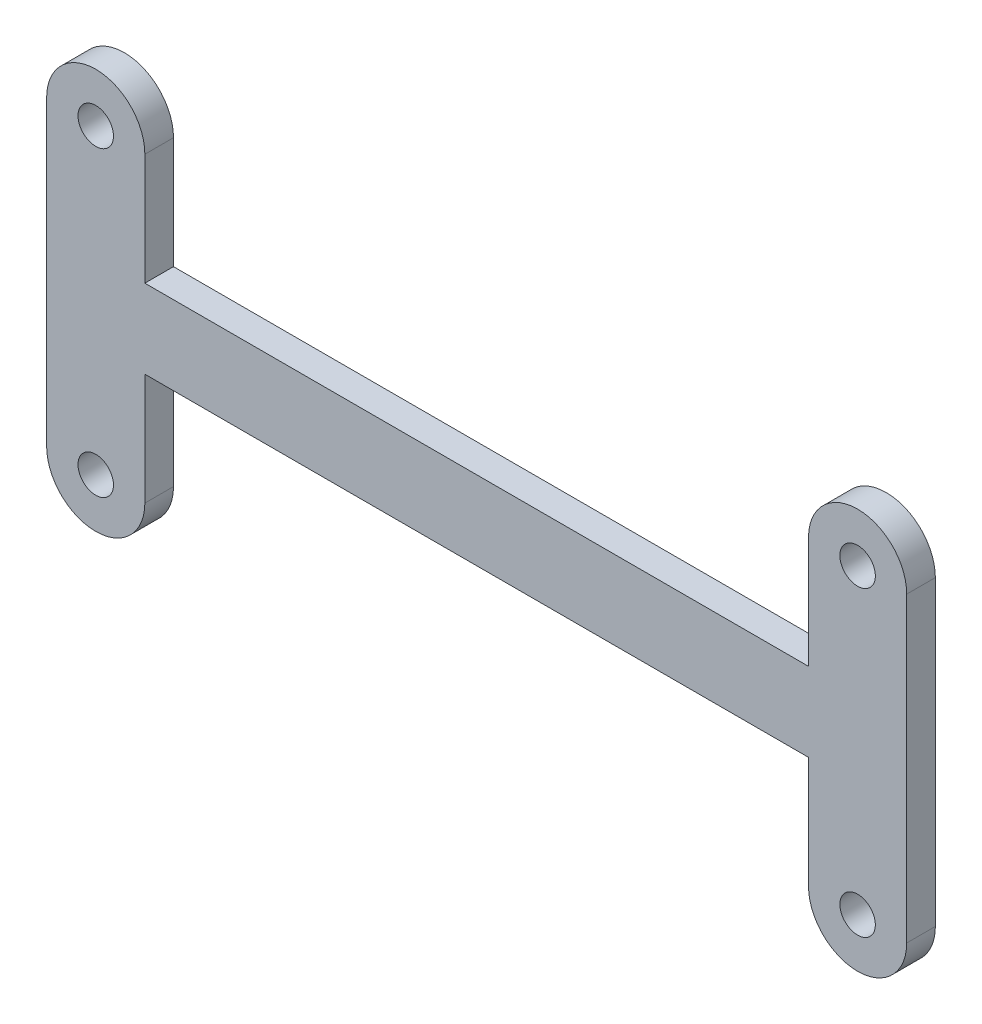
ISO-10303-21;
HEADER;
FILE_DESCRIPTION(('STEP AP214'),'2;1');
FILE_NAME('part.step','',(''),(''),'','','');
FILE_SCHEMA(('AUTOMOTIVE_DESIGN { 1 0 10303 214 1 1 1 1 }'));
ENDSEC;
DATA;
#1=APPLICATION_CONTEXT('core data for automotive mechanical design processes');
#2=APPLICATION_PROTOCOL_DEFINITION('international standard','automotive_design',2000,#1);
#3=PRODUCT_CONTEXT('',#1,'mechanical');
#4=PRODUCT('Part','Part','',(#3));
#5=PRODUCT_RELATED_PRODUCT_CATEGORY('part','',(#4));
#6=PRODUCT_DEFINITION_FORMATION('','',#4);
#7=PRODUCT_DEFINITION_CONTEXT('part definition',#1,'design');
#8=PRODUCT_DEFINITION('design','',#6,#7);
#9=PRODUCT_DEFINITION_SHAPE('','',#8);
#10=(LENGTH_UNIT() NAMED_UNIT(*) SI_UNIT(.MILLI.,.METRE.));
#11=(NAMED_UNIT(*) PLANE_ANGLE_UNIT() SI_UNIT($,.RADIAN.));
#12=(NAMED_UNIT(*) SI_UNIT($,.STERADIAN.) SOLID_ANGLE_UNIT());
#13=UNCERTAINTY_MEASURE_WITH_UNIT(LENGTH_MEASURE(1.E-05),#10,'distance_accuracy_value','');
#14=(GEOMETRIC_REPRESENTATION_CONTEXT(3) GLOBAL_UNCERTAINTY_ASSIGNED_CONTEXT((#13)) GLOBAL_UNIT_ASSIGNED_CONTEXT((#10,
#11,#12)) REPRESENTATION_CONTEXT('',''));
#15=CARTESIAN_POINT('',(0.,0.,0.));
#16=DIRECTION('',(0.,0.,1.));
#17=DIRECTION('',(1.,0.,0.));
#18=AXIS2_PLACEMENT_3D('',#15,#16,#17);
#19=CARTESIAN_POINT('',(-29.,11.5,2.18));
#20=DIRECTION('',(0.,0.,-1.));
#21=DIRECTION('',(-1.,0.,0.));
#22=AXIS2_PLACEMENT_3D('',#19,#20,#21);
#23=CYLINDRICAL_SURFACE('',#22,3.73775917780597);
#24=CARTESIAN_POINT('',(-29.,11.5,0.));
#25=DIRECTION('',(0.,0.,1.));
#26=DIRECTION('',(1.,0.,0.));
#27=AXIS2_PLACEMENT_3D('',#24,#25,#26);
#28=CIRCLE('',#27,3.73775917780597);
#29=CARTESIAN_POINT('',(-25.262240822194,11.5,0.));
#30=VERTEX_POINT('',#29);
#31=CARTESIAN_POINT('',(-32.737759177806,11.5,0.));
#32=VERTEX_POINT('',#31);
#33=EDGE_CURVE('E179',#30,#32,#28,.T.);
#34=ORIENTED_EDGE('',*,*,#33,.T.);
#35=DIRECTION('',(0.,0.,-1.));
#36=VECTOR('',#35,1.);
#37=CARTESIAN_POINT('',(-32.737759177806,11.5,2.18));
#38=LINE('',#37,#36);
#39=CARTESIAN_POINT('',(-32.737759177806,11.5,2.18));
#40=VERTEX_POINT('',#39);
#41=EDGE_CURVE('E11',#40,#32,#38,.T.);
#42=ORIENTED_EDGE('',*,*,#41,.F.);
#43=CARTESIAN_POINT('',(-29.,11.5,2.18));
#44=DIRECTION('',(0.,0.,1.));
#45=DIRECTION('',(1.,0.,0.));
#46=AXIS2_PLACEMENT_3D('',#43,#44,#45);
#47=CIRCLE('',#46,3.73775917780597);
#48=CARTESIAN_POINT('',(-25.262240822194,11.5,2.18));
#49=VERTEX_POINT('',#48);
#50=EDGE_CURVE('E327',#49,#40,#47,.T.);
#51=ORIENTED_EDGE('',*,*,#50,.F.);
#52=DIRECTION('',(0.,0.,-1.));
#53=VECTOR('',#52,1.);
#54=CARTESIAN_POINT('',(-25.262240822194,11.5,2.18));
#55=LINE('',#54,#53);
#56=EDGE_CURVE('E58',#49,#30,#55,.T.);
#57=ORIENTED_EDGE('',*,*,#56,.T.);
#58=EDGE_LOOP('',(#34,#42,#51,#57));
#59=FACE_BOUND('',#58,.T.);
#60=ADVANCED_FACE('F41',(#59),#23,.T.);
#61=CARTESIAN_POINT('',(-32.737759177806,0.,2.18));
#62=DIRECTION('',(1.,0.,0.));
#63=DIRECTION('',(0.,0.,-1.));
#64=AXIS2_PLACEMENT_3D('',#61,#62,#63);
#65=PLANE('',#64);
#66=DIRECTION('',(0.,-1.,0.));
#67=VECTOR('',#66,1.);
#68=CARTESIAN_POINT('',(-32.737759177806,0.,0.));
#69=LINE('',#68,#67);
#70=CARTESIAN_POINT('',(-32.737759177806,-11.5,0.));
#71=VERTEX_POINT('',#70);
#72=EDGE_CURVE('E181',#32,#71,#69,.T.);
#73=ORIENTED_EDGE('',*,*,#72,.T.);
#74=DIRECTION('',(0.,0.,-1.));
#75=VECTOR('',#74,1.);
#76=CARTESIAN_POINT('',(-32.737759177806,-11.5,2.18));
#77=LINE('',#76,#75);
#78=CARTESIAN_POINT('',(-32.737759177806,-11.5,2.18));
#79=VERTEX_POINT('',#78);
#80=EDGE_CURVE('E50',#79,#71,#77,.T.);
#81=ORIENTED_EDGE('',*,*,#80,.F.);
#82=DIRECTION('',(0.,-1.,0.));
#83=VECTOR('',#82,1.);
#84=CARTESIAN_POINT('',(-32.737759177806,0.,2.18));
#85=LINE('',#84,#83);
#86=EDGE_CURVE('E108',#40,#79,#85,.T.);
#87=ORIENTED_EDGE('',*,*,#86,.F.);
#88=ORIENTED_EDGE('',*,*,#41,.T.);
#89=EDGE_LOOP('',(#73,#81,#87,#88));
#90=FACE_BOUND('',#89,.T.);
#91=ADVANCED_FACE('F280',(#90),#65,.F.);
#92=CARTESIAN_POINT('',(-29.,-11.5,2.18));
#93=DIRECTION('',(0.,0.,-1.));
#94=DIRECTION('',(-1.,0.,0.));
#95=AXIS2_PLACEMENT_3D('',#92,#93,#94);
#96=CYLINDRICAL_SURFACE('',#95,3.73775917780597);
#97=CARTESIAN_POINT('',(-29.,-11.5,0.));
#98=DIRECTION('',(0.,0.,1.));
#99=DIRECTION('',(1.,0.,0.));
#100=AXIS2_PLACEMENT_3D('',#97,#98,#99);
#101=CIRCLE('',#100,3.73775917780597);
#102=CARTESIAN_POINT('',(-25.262240822194,-11.5,0.));
#103=VERTEX_POINT('',#102);
#104=EDGE_CURVE('E183',#71,#103,#101,.T.);
#105=ORIENTED_EDGE('',*,*,#104,.T.);
#106=DIRECTION('',(0.,0.,-1.));
#107=VECTOR('',#106,1.);
#108=CARTESIAN_POINT('',(-25.262240822194,-11.5,2.18));
#109=LINE('',#108,#107);
#110=CARTESIAN_POINT('',(-25.262240822194,-11.5,2.18));
#111=VERTEX_POINT('',#110);
#112=EDGE_CURVE('E230',#111,#103,#109,.T.);
#113=ORIENTED_EDGE('',*,*,#112,.F.);
#114=CARTESIAN_POINT('',(-29.,-11.5,2.18));
#115=DIRECTION('',(0.,0.,1.));
#116=DIRECTION('',(1.,0.,0.));
#117=AXIS2_PLACEMENT_3D('',#114,#115,#116);
#118=CIRCLE('',#117,3.73775917780597);
#119=EDGE_CURVE('E237',#79,#111,#118,.T.);
#120=ORIENTED_EDGE('',*,*,#119,.F.);
#121=ORIENTED_EDGE('',*,*,#80,.T.);
#122=EDGE_LOOP('',(#105,#113,#120,#121));
#123=FACE_BOUND('',#122,.T.);
#124=ADVANCED_FACE('F235',(#123),#96,.T.);
#125=CARTESIAN_POINT('',(-25.262240822194,0.,2.18));
#126=DIRECTION('',(1.,0.,0.));
#127=DIRECTION('',(0.,1.,0.));
#128=AXIS2_PLACEMENT_3D('',#125,#126,#127);
#129=PLANE('',#128);
#130=DIRECTION('',(0.,-1.,0.));
#131=VECTOR('',#130,1.);
#132=CARTESIAN_POINT('',(-25.262240822194,0.,0.));
#133=LINE('',#132,#131);
#134=CARTESIAN_POINT('',(-25.262240822194,-3.,0.));
#135=VERTEX_POINT('',#134);
#136=EDGE_CURVE('E186',#135,#103,#133,.T.);
#137=ORIENTED_EDGE('',*,*,#136,.F.);
#138=DIRECTION('',(0.,0.,-1.));
#139=VECTOR('',#138,1.);
#140=CARTESIAN_POINT('',(-25.262240822194,-3.,2.18));
#141=LINE('',#140,#139);
#142=CARTESIAN_POINT('',(-25.262240822194,-3.,2.18));
#143=VERTEX_POINT('',#142);
#144=EDGE_CURVE('E228',#143,#135,#141,.T.);
#145=ORIENTED_EDGE('',*,*,#144,.F.);
#146=DIRECTION('',(0.,-1.,0.));
#147=VECTOR('',#146,1.);
#148=CARTESIAN_POINT('',(-25.262240822194,0.,2.18));
#149=LINE('',#148,#147);
#150=EDGE_CURVE('E164',#143,#111,#149,.T.);
#151=ORIENTED_EDGE('',*,*,#150,.T.);
#152=ORIENTED_EDGE('',*,*,#112,.T.);
#153=EDGE_LOOP('',(#137,#145,#151,#152));
#154=FACE_BOUND('',#153,.T.);
#155=ADVANCED_FACE('F244',(#154),#129,.T.);
#156=CARTESIAN_POINT('',(0.,-3.,2.18));
#157=DIRECTION('',(0.,1.,0.));
#158=DIRECTION('',(-1.,0.,0.));
#159=AXIS2_PLACEMENT_3D('',#156,#157,#158);
#160=PLANE('',#159);
#161=DIRECTION('',(1.,0.,0.));
#162=VECTOR('',#161,1.);
#163=CARTESIAN_POINT('',(0.,-3.,0.));
#164=LINE('',#163,#162);
#165=CARTESIAN_POINT('',(25.262240822194,-3.,0.));
#166=VERTEX_POINT('',#165);
#167=EDGE_CURVE('E189',#135,#166,#164,.T.);
#168=ORIENTED_EDGE('',*,*,#167,.T.);
#169=DIRECTION('',(0.,0.,-1.));
#170=VECTOR('',#169,1.);
#171=CARTESIAN_POINT('',(25.262240822194,-3.,2.18));
#172=LINE('',#171,#170);
#173=CARTESIAN_POINT('',(25.262240822194,-3.,2.18));
#174=VERTEX_POINT('',#173);
#175=EDGE_CURVE('E226',#174,#166,#172,.T.);
#176=ORIENTED_EDGE('',*,*,#175,.F.);
#177=DIRECTION('',(1.,0.,0.));
#178=VECTOR('',#177,1.);
#179=CARTESIAN_POINT('',(0.,-3.,2.18));
#180=LINE('',#179,#178);
#181=EDGE_CURVE('E248',#143,#174,#180,.T.);
#182=ORIENTED_EDGE('',*,*,#181,.F.);
#183=ORIENTED_EDGE('',*,*,#144,.T.);
#184=EDGE_LOOP('',(#168,#176,#182,#183));
#185=FACE_BOUND('',#184,.T.);
#186=ADVANCED_FACE('F288',(#185),#160,.F.);
#187=CARTESIAN_POINT('',(25.262240822194,0.,2.18));
#188=DIRECTION('',(-1.,0.,0.));
#189=DIRECTION('',(0.,0.,1.));
#190=AXIS2_PLACEMENT_3D('',#187,#188,#189);
#191=PLANE('',#190);
#192=DIRECTION('',(0.,1.,0.));
#193=VECTOR('',#192,1.);
#194=CARTESIAN_POINT('',(25.262240822194,0.,0.));
#195=LINE('',#194,#193);
#196=CARTESIAN_POINT('',(25.262240822194,-11.5,0.));
#197=VERTEX_POINT('',#196);
#198=EDGE_CURVE('E193',#197,#166,#195,.T.);
#199=ORIENTED_EDGE('',*,*,#198,.F.);
#200=DIRECTION('',(0.,0.,-1.));
#201=VECTOR('',#200,1.);
#202=CARTESIAN_POINT('',(25.262240822194,-11.5,2.18));
#203=LINE('',#202,#201);
#204=CARTESIAN_POINT('',(25.262240822194,-11.5,2.18));
#205=VERTEX_POINT('',#204);
#206=EDGE_CURVE('E224',#205,#197,#203,.T.);
#207=ORIENTED_EDGE('',*,*,#206,.F.);
#208=DIRECTION('',(0.,1.,0.));
#209=VECTOR('',#208,1.);
#210=CARTESIAN_POINT('',(25.262240822194,0.,2.18));
#211=LINE('',#210,#209);
#212=EDGE_CURVE('E158',#205,#174,#211,.T.);
#213=ORIENTED_EDGE('',*,*,#212,.T.);
#214=ORIENTED_EDGE('',*,*,#175,.T.);
#215=EDGE_LOOP('',(#199,#207,#213,#214));
#216=FACE_BOUND('',#215,.T.);
#217=ADVANCED_FACE('F277',(#216),#191,.T.);
#218=CARTESIAN_POINT('',(29.,-11.5,2.18));
#219=DIRECTION('',(0.,0.,-1.));
#220=DIRECTION('',(-1.,0.,0.));
#221=AXIS2_PLACEMENT_3D('',#218,#219,#220);
#222=CYLINDRICAL_SURFACE('',#221,3.73775917780597);
#223=CARTESIAN_POINT('',(29.,-11.5,0.));
#224=DIRECTION('',(0.,0.,1.));
#225=DIRECTION('',(1.,0.,0.));
#226=AXIS2_PLACEMENT_3D('',#223,#224,#225);
#227=CIRCLE('',#226,3.73775917780597);
#228=CARTESIAN_POINT('',(32.737759177806,-11.5,0.));
#229=VERTEX_POINT('',#228);
#230=EDGE_CURVE('E196',#197,#229,#227,.T.);
#231=ORIENTED_EDGE('',*,*,#230,.T.);
#232=DIRECTION('',(0.,0.,-1.));
#233=VECTOR('',#232,1.);
#234=CARTESIAN_POINT('',(32.737759177806,-11.5,2.18));
#235=LINE('',#234,#233);
#236=CARTESIAN_POINT('',(32.737759177806,-11.5,2.18));
#237=VERTEX_POINT('',#236);
#238=EDGE_CURVE('E222',#237,#229,#235,.T.);
#239=ORIENTED_EDGE('',*,*,#238,.F.);
#240=CARTESIAN_POINT('',(29.,-11.5,2.18));
#241=DIRECTION('',(0.,0.,1.));
#242=DIRECTION('',(1.,0.,0.));
#243=AXIS2_PLACEMENT_3D('',#240,#241,#242);
#244=CIRCLE('',#243,3.73775917780597);
#245=EDGE_CURVE('E254',#205,#237,#244,.T.);
#246=ORIENTED_EDGE('',*,*,#245,.F.);
#247=ORIENTED_EDGE('',*,*,#206,.T.);
#248=EDGE_LOOP('',(#231,#239,#246,#247));
#249=FACE_BOUND('',#248,.T.);
#250=ADVANCED_FACE('F264',(#249),#222,.T.);
#251=CARTESIAN_POINT('',(32.737759177806,0.,2.18));
#252=DIRECTION('',(1.,0.,0.));
#253=DIRECTION('',(0.,0.,-1.));
#254=AXIS2_PLACEMENT_3D('',#251,#252,#253);
#255=PLANE('',#254);
#256=DIRECTION('',(0.,-1.,0.));
#257=VECTOR('',#256,1.);
#258=CARTESIAN_POINT('',(32.737759177806,0.,0.));
#259=LINE('',#258,#257);
#260=CARTESIAN_POINT('',(32.737759177806,11.5,0.));
#261=VERTEX_POINT('',#260);
#262=EDGE_CURVE('E199',#261,#229,#259,.T.);
#263=ORIENTED_EDGE('',*,*,#262,.F.);
#264=DIRECTION('',(0.,0.,-1.));
#265=VECTOR('',#264,1.);
#266=CARTESIAN_POINT('',(32.737759177806,11.5,2.18));
#267=LINE('',#266,#265);
#268=CARTESIAN_POINT('',(32.737759177806,11.5,2.18));
#269=VERTEX_POINT('',#268);
#270=EDGE_CURVE('E220',#269,#261,#267,.T.);
#271=ORIENTED_EDGE('',*,*,#270,.F.);
#272=DIRECTION('',(0.,-1.,0.));
#273=VECTOR('',#272,1.);
#274=CARTESIAN_POINT('',(32.737759177806,0.,2.18));
#275=LINE('',#274,#273);
#276=EDGE_CURVE('E255',#269,#237,#275,.T.);
#277=ORIENTED_EDGE('',*,*,#276,.T.);
#278=ORIENTED_EDGE('',*,*,#238,.T.);
#279=EDGE_LOOP('',(#263,#271,#277,#278));
#280=FACE_BOUND('',#279,.T.);
#281=ADVANCED_FACE('F259',(#280),#255,.T.);
#282=CARTESIAN_POINT('',(29.,11.5,2.18));
#283=DIRECTION('',(0.,0.,-1.));
#284=DIRECTION('',(-1.,0.,0.));
#285=AXIS2_PLACEMENT_3D('',#282,#283,#284);
#286=CYLINDRICAL_SURFACE('',#285,3.73775917780597);
#287=CARTESIAN_POINT('',(29.,11.5,0.));
#288=DIRECTION('',(0.,0.,1.));
#289=DIRECTION('',(1.,0.,0.));
#290=AXIS2_PLACEMENT_3D('',#287,#288,#289);
#291=CIRCLE('',#290,3.73775917780597);
#292=CARTESIAN_POINT('',(25.262240822194,11.5,0.));
#293=VERTEX_POINT('',#292);
#294=EDGE_CURVE('E202',#261,#293,#291,.T.);
#295=ORIENTED_EDGE('',*,*,#294,.T.);
#296=DIRECTION('',(0.,0.,-1.));
#297=VECTOR('',#296,1.);
#298=CARTESIAN_POINT('',(25.262240822194,11.5,2.18));
#299=LINE('',#298,#297);
#300=CARTESIAN_POINT('',(25.262240822194,11.5,2.18));
#301=VERTEX_POINT('',#300);
#302=EDGE_CURVE('E145',#301,#293,#299,.T.);
#303=ORIENTED_EDGE('',*,*,#302,.F.);
#304=CARTESIAN_POINT('',(29.,11.5,2.18));
#305=DIRECTION('',(0.,0.,1.));
#306=DIRECTION('',(1.,0.,0.));
#307=AXIS2_PLACEMENT_3D('',#304,#305,#306);
#308=CIRCLE('',#307,3.73775917780597);
#309=EDGE_CURVE('E155',#269,#301,#308,.T.);
#310=ORIENTED_EDGE('',*,*,#309,.F.);
#311=ORIENTED_EDGE('',*,*,#270,.T.);
#312=EDGE_LOOP('',(#295,#303,#310,#311));
#313=FACE_BOUND('',#312,.T.);
#314=ADVANCED_FACE('F269',(#313),#286,.T.);
#315=CARTESIAN_POINT('',(25.262240822194,3.,0.));
#316=VERTEX_POINT('',#315);
#317=EDGE_CURVE('E141',#316,#293,#195,.T.);
#318=ORIENTED_EDGE('',*,*,#317,.F.);
#319=DIRECTION('',(0.,0.,-1.));
#320=VECTOR('',#319,1.);
#321=CARTESIAN_POINT('',(25.262240822194,3.,2.18));
#322=LINE('',#321,#320);
#323=CARTESIAN_POINT('',(25.262240822194,3.,2.18));
#324=VERTEX_POINT('',#323);
#325=EDGE_CURVE('E136',#324,#316,#322,.T.);
#326=ORIENTED_EDGE('',*,*,#325,.F.);
#327=EDGE_CURVE('E139',#324,#301,#211,.T.);
#328=ORIENTED_EDGE('',*,*,#327,.T.);
#329=ORIENTED_EDGE('',*,*,#302,.T.);
#330=EDGE_LOOP('',(#318,#326,#328,#329));
#331=FACE_BOUND('',#330,.T.);
#332=ADVANCED_FACE('F138',(#331),#191,.T.);
#333=CARTESIAN_POINT('',(0.,3.,2.18));
#334=DIRECTION('',(0.,1.,0.));
#335=DIRECTION('',(0.,0.,1.));
#336=AXIS2_PLACEMENT_3D('',#333,#334,#335);
#337=PLANE('',#336);
#338=DIRECTION('',(1.,0.,0.));
#339=VECTOR('',#338,1.);
#340=CARTESIAN_POINT('',(0.,3.,0.));
#341=LINE('',#340,#339);
#342=CARTESIAN_POINT('',(-25.262240822194,3.,0.));
#343=VERTEX_POINT('',#342);
#344=EDGE_CURVE('E205',#343,#316,#341,.T.);
#345=ORIENTED_EDGE('',*,*,#344,.F.);
#346=DIRECTION('',(0.,0.,-1.));
#347=VECTOR('',#346,1.);
#348=CARTESIAN_POINT('',(-25.262240822194,3.,2.18));
#349=LINE('',#348,#347);
#350=CARTESIAN_POINT('',(-25.262240822194,3.,2.18));
#351=VERTEX_POINT('',#350);
#352=EDGE_CURVE('E96',#351,#343,#349,.T.);
#353=ORIENTED_EDGE('',*,*,#352,.F.);
#354=DIRECTION('',(1.,0.,0.));
#355=VECTOR('',#354,1.);
#356=CARTESIAN_POINT('',(0.,3.,2.18));
#357=LINE('',#356,#355);
#358=EDGE_CURVE('E152',#351,#324,#357,.T.);
#359=ORIENTED_EDGE('',*,*,#358,.T.);
#360=ORIENTED_EDGE('',*,*,#325,.T.);
#361=EDGE_LOOP('',(#345,#353,#359,#360));
#362=FACE_BOUND('',#361,.T.);
#363=ADVANCED_FACE('F159',(#362),#337,.T.);
#364=CARTESIAN_POINT('',(29.,11.5,2.18));
#365=DIRECTION('',(0.,0.,-1.));
#366=DIRECTION('',(-1.,0.,0.));
#367=AXIS2_PLACEMENT_3D('',#364,#365,#366);
#368=CYLINDRICAL_SURFACE('',#367,1.35);
#369=CARTESIAN_POINT('',(29.,11.5,2.18));
#370=DIRECTION('',(0.,0.,1.));
#371=DIRECTION('',(1.,0.,0.));
#372=AXIS2_PLACEMENT_3D('',#369,#370,#371);
#373=CIRCLE('',#372,1.35);
#374=CARTESIAN_POINT('',(30.35,11.5,2.18));
#375=VERTEX_POINT('',#374);
#376=EDGE_CURVE('E170',#375,#375,#373,.T.);
#377=ORIENTED_EDGE('',*,*,#376,.T.);
#378=EDGE_LOOP('',(#377));
#379=FACE_BOUND('',#378,.T.);
#380=CARTESIAN_POINT('',(29.,11.5,0.));
#381=DIRECTION('',(0.,0.,1.));
#382=DIRECTION('',(1.,0.,0.));
#383=AXIS2_PLACEMENT_3D('',#380,#381,#382);
#384=CIRCLE('',#383,1.35);
#385=CARTESIAN_POINT('',(30.35,11.5,0.));
#386=VERTEX_POINT('',#385);
#387=EDGE_CURVE('E210',#386,#386,#384,.T.);
#388=ORIENTED_EDGE('',*,*,#387,.F.);
#389=EDGE_LOOP('',(#388));
#390=FACE_BOUND('',#389,.T.);
#391=ADVANCED_FACE('F302',(#379,#390),#368,.F.);
#392=CARTESIAN_POINT('',(-29.,-11.5,2.18));
#393=DIRECTION('',(0.,0.,-1.));
#394=DIRECTION('',(-1.,0.,0.));
#395=AXIS2_PLACEMENT_3D('',#392,#393,#394);
#396=CYLINDRICAL_SURFACE('',#395,1.35);
#397=CARTESIAN_POINT('',(-29.,-11.5,2.18));
#398=DIRECTION('',(0.,0.,1.));
#399=DIRECTION('',(1.,0.,0.));
#400=AXIS2_PLACEMENT_3D('',#397,#398,#399);
#401=CIRCLE('',#400,1.35);
#402=CARTESIAN_POINT('',(-27.65,-11.5,2.18));
#403=VERTEX_POINT('',#402);
#404=EDGE_CURVE('E162',#403,#403,#401,.T.);
#405=ORIENTED_EDGE('',*,*,#404,.T.);
#406=EDGE_LOOP('',(#405));
#407=FACE_BOUND('',#406,.T.);
#408=CARTESIAN_POINT('',(-29.,-11.5,0.));
#409=DIRECTION('',(0.,0.,1.));
#410=DIRECTION('',(1.,0.,0.));
#411=AXIS2_PLACEMENT_3D('',#408,#409,#410);
#412=CIRCLE('',#411,1.35);
#413=CARTESIAN_POINT('',(-27.65,-11.5,0.));
#414=VERTEX_POINT('',#413);
#415=EDGE_CURVE('E207',#414,#414,#412,.T.);
#416=ORIENTED_EDGE('',*,*,#415,.F.);
#417=EDGE_LOOP('',(#416));
#418=FACE_BOUND('',#417,.T.);
#419=ADVANCED_FACE('F306',(#407,#418),#396,.F.);
#420=EDGE_CURVE('E190',#30,#343,#133,.T.);
#421=ORIENTED_EDGE('',*,*,#420,.F.);
#422=ORIENTED_EDGE('',*,*,#56,.F.);
#423=EDGE_CURVE('E160',#49,#351,#149,.T.);
#424=ORIENTED_EDGE('',*,*,#423,.T.);
#425=ORIENTED_EDGE('',*,*,#352,.T.);
#426=EDGE_LOOP('',(#421,#422,#424,#425));
#427=FACE_BOUND('',#426,.T.);
#428=ADVANCED_FACE('F303',(#427),#129,.T.);
#429=CARTESIAN_POINT('',(-29.,11.5,2.18));
#430=DIRECTION('',(0.,0.,-1.));
#431=DIRECTION('',(-1.,0.,0.));
#432=AXIS2_PLACEMENT_3D('',#429,#430,#431);
#433=CYLINDRICAL_SURFACE('',#432,1.35);
#434=CARTESIAN_POINT('',(-29.,11.5,2.18));
#435=DIRECTION('',(0.,0.,1.));
#436=DIRECTION('',(1.,0.,0.));
#437=AXIS2_PLACEMENT_3D('',#434,#435,#436);
#438=CIRCLE('',#437,1.35);
#439=CARTESIAN_POINT('',(-27.65,11.5,2.18));
#440=VERTEX_POINT('',#439);
#441=EDGE_CURVE('E216',#440,#440,#438,.T.);
#442=ORIENTED_EDGE('',*,*,#441,.T.);
#443=EDGE_LOOP('',(#442));
#444=FACE_BOUND('',#443,.T.);
#445=CARTESIAN_POINT('',(-29.,11.5,0.));
#446=DIRECTION('',(0.,0.,1.));
#447=DIRECTION('',(1.,0.,0.));
#448=AXIS2_PLACEMENT_3D('',#445,#446,#447);
#449=CIRCLE('',#448,1.35);
#450=CARTESIAN_POINT('',(-27.65,11.5,0.));
#451=VERTEX_POINT('',#450);
#452=EDGE_CURVE('E176',#451,#451,#449,.T.);
#453=ORIENTED_EDGE('',*,*,#452,.F.);
#454=EDGE_LOOP('',(#453));
#455=FACE_BOUND('',#454,.T.);
#456=ADVANCED_FACE('F43',(#444,#455),#433,.F.);
#457=CARTESIAN_POINT('',(29.,-11.5,2.18));
#458=DIRECTION('',(0.,0.,-1.));
#459=DIRECTION('',(-1.,0.,0.));
#460=AXIS2_PLACEMENT_3D('',#457,#458,#459);
#461=CYLINDRICAL_SURFACE('',#460,1.35);
#462=CARTESIAN_POINT('',(29.,-11.5,2.18));
#463=DIRECTION('',(0.,0.,1.));
#464=DIRECTION('',(1.,0.,0.));
#465=AXIS2_PLACEMENT_3D('',#462,#463,#464);
#466=CIRCLE('',#465,1.35);
#467=CARTESIAN_POINT('',(30.35,-11.5,2.18));
#468=VERTEX_POINT('',#467);
#469=EDGE_CURVE('E173',#468,#468,#466,.T.);
#470=ORIENTED_EDGE('',*,*,#469,.T.);
#471=EDGE_LOOP('',(#470));
#472=FACE_BOUND('',#471,.T.);
#473=CARTESIAN_POINT('',(29.,-11.5,0.));
#474=DIRECTION('',(0.,0.,1.));
#475=DIRECTION('',(1.,0.,0.));
#476=AXIS2_PLACEMENT_3D('',#473,#474,#475);
#477=CIRCLE('',#476,1.35);
#478=CARTESIAN_POINT('',(30.35,-11.5,0.));
#479=VERTEX_POINT('',#478);
#480=EDGE_CURVE('E213',#479,#479,#477,.T.);
#481=ORIENTED_EDGE('',*,*,#480,.F.);
#482=EDGE_LOOP('',(#481));
#483=FACE_BOUND('',#482,.T.);
#484=ADVANCED_FACE('F313',(#472,#483),#461,.F.);
#485=CARTESIAN_POINT('',(0.,0.,2.18));
#486=DIRECTION('',(0.,0.,1.));
#487=DIRECTION('',(1.,0.,0.));
#488=AXIS2_PLACEMENT_3D('',#485,#486,#487);
#489=PLANE('',#488);
#490=ORIENTED_EDGE('',*,*,#441,.F.);
#491=EDGE_LOOP('',(#490));
#492=FACE_BOUND('',#491,.T.);
#493=ORIENTED_EDGE('',*,*,#50,.T.);
#494=ORIENTED_EDGE('',*,*,#86,.T.);
#495=ORIENTED_EDGE('',*,*,#119,.T.);
#496=ORIENTED_EDGE('',*,*,#150,.F.);
#497=ORIENTED_EDGE('',*,*,#181,.T.);
#498=ORIENTED_EDGE('',*,*,#212,.F.);
#499=ORIENTED_EDGE('',*,*,#245,.T.);
#500=ORIENTED_EDGE('',*,*,#276,.F.);
#501=ORIENTED_EDGE('',*,*,#309,.T.);
#502=ORIENTED_EDGE('',*,*,#327,.F.);
#503=ORIENTED_EDGE('',*,*,#358,.F.);
#504=ORIENTED_EDGE('',*,*,#423,.F.);
#505=EDGE_LOOP('',(#493,#494,#495,#496,#497,#498,#499,#500,#501,#502,#503,#504));
#506=FACE_BOUND('',#505,.T.);
#507=ORIENTED_EDGE('',*,*,#404,.F.);
#508=EDGE_LOOP('',(#507));
#509=FACE_BOUND('',#508,.T.);
#510=ORIENTED_EDGE('',*,*,#376,.F.);
#511=EDGE_LOOP('',(#510));
#512=FACE_BOUND('',#511,.T.);
#513=ORIENTED_EDGE('',*,*,#469,.F.);
#514=EDGE_LOOP('',(#513));
#515=FACE_BOUND('',#514,.T.);
#516=ADVANCED_FACE('F149',(#492,#506,#509,#512,#515),#489,.T.);
#517=CARTESIAN_POINT('',(0.,0.,0.));
#518=DIRECTION('',(0.,0.,1.));
#519=DIRECTION('',(1.,0.,0.));
#520=AXIS2_PLACEMENT_3D('',#517,#518,#519);
#521=PLANE('',#520);
#522=ORIENTED_EDGE('',*,*,#452,.T.);
#523=EDGE_LOOP('',(#522));
#524=FACE_BOUND('',#523,.T.);
#525=ORIENTED_EDGE('',*,*,#33,.F.);
#526=ORIENTED_EDGE('',*,*,#420,.T.);
#527=ORIENTED_EDGE('',*,*,#344,.T.);
#528=ORIENTED_EDGE('',*,*,#317,.T.);
#529=ORIENTED_EDGE('',*,*,#294,.F.);
#530=ORIENTED_EDGE('',*,*,#262,.T.);
#531=ORIENTED_EDGE('',*,*,#230,.F.);
#532=ORIENTED_EDGE('',*,*,#198,.T.);
#533=ORIENTED_EDGE('',*,*,#167,.F.);
#534=ORIENTED_EDGE('',*,*,#136,.T.);
#535=ORIENTED_EDGE('',*,*,#104,.F.);
#536=ORIENTED_EDGE('',*,*,#72,.F.);
#537=EDGE_LOOP('',(#525,#526,#527,#528,#529,#530,#531,#532,#533,#534,#535,#536));
#538=FACE_BOUND('',#537,.T.);
#539=ORIENTED_EDGE('',*,*,#415,.T.);
#540=EDGE_LOOP('',(#539));
#541=FACE_BOUND('',#540,.T.);
#542=ORIENTED_EDGE('',*,*,#387,.T.);
#543=EDGE_LOOP('',(#542));
#544=FACE_BOUND('',#543,.T.);
#545=ORIENTED_EDGE('',*,*,#480,.T.);
#546=EDGE_LOOP('',(#545));
#547=FACE_BOUND('',#546,.T.);
#548=ADVANCED_FACE('F239',(#524,#538,#541,#544,#547),#521,.F.);
#549=CLOSED_SHELL('',(#60,#91,#124,#155,#186,#217,#250,#281,#314,#332,#363,#391,#419,#428,#456,
#484,#516,#548));
#550=MANIFOLD_SOLID_BREP('B2',#549);
#551=ADVANCED_BREP_SHAPE_REPRESENTATION('',(#18,#550),#14);
#552=SHAPE_DEFINITION_REPRESENTATION(#9,#551);
ENDSEC;
END-ISO-10303-21;
